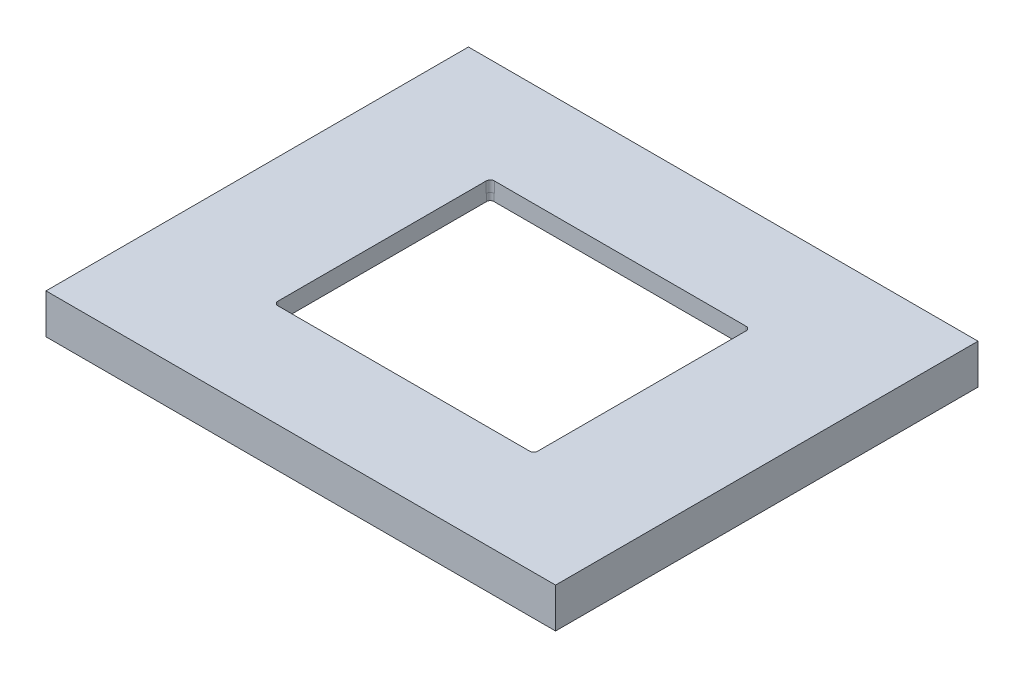
ISO-10303-21;
HEADER;
FILE_DESCRIPTION(('STEP AP214'),'2;1');
FILE_NAME('part.step','',(''),(''),'','','');
FILE_SCHEMA(('AUTOMOTIVE_DESIGN { 1 0 10303 214 1 1 1 1 }'));
ENDSEC;
DATA;
#1=APPLICATION_CONTEXT('core data for automotive mechanical design processes');
#2=APPLICATION_PROTOCOL_DEFINITION('international standard','automotive_design',2000,#1);
#3=PRODUCT_CONTEXT('',#1,'mechanical');
#4=PRODUCT('Part','Part','',(#3));
#5=PRODUCT_RELATED_PRODUCT_CATEGORY('part','',(#4));
#6=PRODUCT_DEFINITION_FORMATION('','',#4);
#7=PRODUCT_DEFINITION_CONTEXT('part definition',#1,'design');
#8=PRODUCT_DEFINITION('design','',#6,#7);
#9=PRODUCT_DEFINITION_SHAPE('','',#8);
#10=(LENGTH_UNIT() NAMED_UNIT(*) SI_UNIT(.MILLI.,.METRE.));
#11=(NAMED_UNIT(*) PLANE_ANGLE_UNIT() SI_UNIT($,.RADIAN.));
#12=(NAMED_UNIT(*) SI_UNIT($,.STERADIAN.) SOLID_ANGLE_UNIT());
#13=UNCERTAINTY_MEASURE_WITH_UNIT(LENGTH_MEASURE(1.E-05),#10,'distance_accuracy_value','');
#14=(GEOMETRIC_REPRESENTATION_CONTEXT(3) GLOBAL_UNCERTAINTY_ASSIGNED_CONTEXT((#13)) GLOBAL_UNIT_ASSIGNED_CONTEXT((#10,
#11,#12)) REPRESENTATION_CONTEXT('',''));
#15=CARTESIAN_POINT('',(0.,0.,0.));
#16=DIRECTION('',(0.,0.,1.));
#17=DIRECTION('',(1.,0.,0.));
#18=AXIS2_PLACEMENT_3D('',#15,#16,#17);
#19=CARTESIAN_POINT('',(0.,4.,0.));
#20=DIRECTION('',(0.,1.,0.));
#21=DIRECTION('',(0.,0.,1.));
#22=AXIS2_PLACEMENT_3D('',#19,#20,#21);
#23=PLANE('',#22);
#24=DIRECTION('',(0.,0.,1.));
#25=VECTOR('',#24,1.);
#26=CARTESIAN_POINT('',(-33.205,4.,27.185));
#27=LINE('',#26,#25);
#28=CARTESIAN_POINT('',(-33.205,4.,-27.185));
#29=VERTEX_POINT('',#28);
#30=CARTESIAN_POINT('',(-33.205,4.,27.185));
#31=VERTEX_POINT('',#30);
#32=EDGE_CURVE('E470',#29,#31,#27,.T.);
#33=ORIENTED_EDGE('',*,*,#32,.F.);
#34=DIRECTION('',(-1.,0.,0.));
#35=VECTOR('',#34,1.);
#36=CARTESIAN_POINT('',(33.205,4.,-27.185));
#37=LINE('',#36,#35);
#38=CARTESIAN_POINT('',(33.205,4.,-27.185));
#39=VERTEX_POINT('',#38);
#40=EDGE_CURVE('E483',#39,#29,#37,.T.);
#41=ORIENTED_EDGE('',*,*,#40,.F.);
#42=DIRECTION('',(0.,0.,-1.));
#43=VECTOR('',#42,1.);
#44=CARTESIAN_POINT('',(33.205,4.,27.185));
#45=LINE('',#44,#43);
#46=CARTESIAN_POINT('',(33.205,4.,27.185));
#47=VERTEX_POINT('',#46);
#48=EDGE_CURVE('E479',#47,#39,#45,.T.);
#49=ORIENTED_EDGE('',*,*,#48,.F.);
#50=DIRECTION('',(1.,0.,0.));
#51=VECTOR('',#50,1.);
#52=CARTESIAN_POINT('',(33.205,4.,27.185));
#53=LINE('',#52,#51);
#54=EDGE_CURVE('E474',#31,#47,#53,.T.);
#55=ORIENTED_EDGE('',*,*,#54,.F.);
#56=EDGE_LOOP('',(#33,#41,#49,#55));
#57=FACE_BOUND('',#56,.T.);
#58=CARTESIAN_POINT('',(17.45,4.,-14.45));
#59=DIRECTION('',(0.,-1.,0.));
#60=DIRECTION('',(0.,0.,-1.));
#61=AXIS2_PLACEMENT_3D('',#58,#59,#60);
#62=CIRCLE('',#61,1.5);
#63=CARTESIAN_POINT('',(17.45,4.,-15.95));
#64=VERTEX_POINT('',#63);
#65=CARTESIAN_POINT('',(18.95,4.,-14.45));
#66=VERTEX_POINT('',#65);
#67=EDGE_CURVE('E276',#64,#66,#62,.T.);
#68=ORIENTED_EDGE('',*,*,#67,.F.);
#69=DIRECTION('',(1.,0.,0.));
#70=VECTOR('',#69,1.);
#71=CARTESIAN_POINT('',(17.45,4.,-15.95));
#72=LINE('',#71,#70);
#73=CARTESIAN_POINT('',(-17.45,4.,-15.95));
#74=VERTEX_POINT('',#73);
#75=EDGE_CURVE('E360',#74,#64,#72,.T.);
#76=ORIENTED_EDGE('',*,*,#75,.F.);
#77=CARTESIAN_POINT('',(-17.45,4.,-14.45));
#78=DIRECTION('',(0.,-1.,0.));
#79=DIRECTION('',(0.,0.,1.));
#80=AXIS2_PLACEMENT_3D('',#77,#78,#79);
#81=CIRCLE('',#80,1.5);
#82=CARTESIAN_POINT('',(-18.95,4.,-14.45));
#83=VERTEX_POINT('',#82);
#84=EDGE_CURVE('E401',#83,#74,#81,.T.);
#85=ORIENTED_EDGE('',*,*,#84,.F.);
#86=DIRECTION('',(0.,0.,-1.));
#87=VECTOR('',#86,1.);
#88=CARTESIAN_POINT('',(-18.95,4.,-14.45));
#89=LINE('',#88,#87);
#90=CARTESIAN_POINT('',(-18.95,4.,14.45));
#91=VERTEX_POINT('',#90);
#92=EDGE_CURVE('E397',#91,#83,#89,.T.);
#93=ORIENTED_EDGE('',*,*,#92,.F.);
#94=CARTESIAN_POINT('',(-17.45,4.,14.45));
#95=DIRECTION('',(0.,-1.,0.));
#96=DIRECTION('',(0.,0.,1.));
#97=AXIS2_PLACEMENT_3D('',#94,#95,#96);
#98=CIRCLE('',#97,1.5);
#99=CARTESIAN_POINT('',(-17.45,4.,15.95));
#100=VERTEX_POINT('',#99);
#101=EDGE_CURVE('E393',#100,#91,#98,.T.);
#102=ORIENTED_EDGE('',*,*,#101,.F.);
#103=DIRECTION('',(-1.,0.,0.));
#104=VECTOR('',#103,1.);
#105=CARTESIAN_POINT('',(17.45,4.,15.95));
#106=LINE('',#105,#104);
#107=CARTESIAN_POINT('',(17.45,4.,15.95));
#108=VERTEX_POINT('',#107);
#109=EDGE_CURVE('E389',#108,#100,#106,.T.);
#110=ORIENTED_EDGE('',*,*,#109,.F.);
#111=CARTESIAN_POINT('',(17.45,4.,14.45));
#112=DIRECTION('',(0.,-1.,0.));
#113=DIRECTION('',(0.,0.,1.));
#114=AXIS2_PLACEMENT_3D('',#111,#112,#113);
#115=CIRCLE('',#114,1.5);
#116=CARTESIAN_POINT('',(18.95,4.,14.45));
#117=VERTEX_POINT('',#116);
#118=EDGE_CURVE('E66',#117,#108,#115,.T.);
#119=ORIENTED_EDGE('',*,*,#118,.F.);
#120=DIRECTION('',(0.,0.,1.));
#121=VECTOR('',#120,1.);
#122=CARTESIAN_POINT('',(18.95,4.,-14.45));
#123=LINE('',#122,#121);
#124=EDGE_CURVE('E61',#66,#117,#123,.T.);
#125=ORIENTED_EDGE('',*,*,#124,.F.);
#126=EDGE_LOOP('',(#68,#76,#85,#93,#102,#110,#119,#125));
#127=FACE_BOUND('',#126,.T.);
#128=ADVANCED_FACE('F45',(#57,#127),#23,.F.);
#129=CARTESIAN_POINT('',(-17.39,4.,-14.39));
#130=DIRECTION('',(0.,1.,0.));
#131=DIRECTION('',(0.,0.,1.));
#132=AXIS2_PLACEMENT_3D('',#129,#130,#131);
#133=CIRCLE('',#132,0.56);
#134=CARTESIAN_POINT('',(-17.39,4.,-14.95));
#135=VERTEX_POINT('',#134);
#136=CARTESIAN_POINT('',(-17.95,4.,-14.39));
#137=VERTEX_POINT('',#136);
#138=EDGE_CURVE('E54',#135,#137,#133,.T.);
#139=ORIENTED_EDGE('',*,*,#138,.T.);
#140=DIRECTION('',(0.,0.,-1.));
#141=VECTOR('',#140,1.);
#142=CARTESIAN_POINT('',(-17.95,4.,-14.45));
#143=LINE('',#142,#141);
#144=CARTESIAN_POINT('',(-17.95,4.,-14.45));
#145=VERTEX_POINT('',#144);
#146=EDGE_CURVE('E307',#137,#145,#143,.T.);
#147=ORIENTED_EDGE('',*,*,#146,.T.);
#148=CARTESIAN_POINT('',(-17.45,4.,-14.45));
#149=DIRECTION('',(0.,-1.,0.));
#150=DIRECTION('',(0.,0.,1.));
#151=AXIS2_PLACEMENT_3D('',#148,#149,#150);
#152=CIRCLE('',#151,0.5);
#153=CARTESIAN_POINT('',(-17.45,4.,-14.95));
#154=VERTEX_POINT('',#153);
#155=EDGE_CURVE('E310',#145,#154,#152,.T.);
#156=ORIENTED_EDGE('',*,*,#155,.T.);
#157=DIRECTION('',(1.,0.,0.));
#158=VECTOR('',#157,1.);
#159=CARTESIAN_POINT('',(17.45,4.,-14.95));
#160=LINE('',#159,#158);
#161=EDGE_CURVE('E314',#154,#135,#160,.T.);
#162=ORIENTED_EDGE('',*,*,#161,.T.);
#163=EDGE_LOOP('',(#139,#147,#156,#162));
#164=FACE_BOUND('',#163,.T.);
#165=ADVANCED_FACE('F591',(#164),#23,.F.);
#166=CARTESIAN_POINT('',(17.39,4.,-14.39));
#167=DIRECTION('',(0.,1.,0.));
#168=DIRECTION('',(0.,0.,1.));
#169=AXIS2_PLACEMENT_3D('',#166,#167,#168);
#170=CIRCLE('',#169,0.56);
#171=CARTESIAN_POINT('',(17.95,4.,-14.39));
#172=VERTEX_POINT('',#171);
#173=CARTESIAN_POINT('',(17.39,4.,-14.95));
#174=VERTEX_POINT('',#173);
#175=EDGE_CURVE('E582',#172,#174,#170,.T.);
#176=ORIENTED_EDGE('',*,*,#175,.T.);
#177=CARTESIAN_POINT('',(17.45,4.,-14.95));
#178=VERTEX_POINT('',#177);
#179=EDGE_CURVE('E313',#174,#178,#160,.T.);
#180=ORIENTED_EDGE('',*,*,#179,.T.);
#181=CARTESIAN_POINT('',(17.45,4.,-14.45));
#182=DIRECTION('',(0.,-1.,0.));
#183=DIRECTION('',(0.,0.,-1.));
#184=AXIS2_PLACEMENT_3D('',#181,#182,#183);
#185=CIRCLE('',#184,0.5);
#186=CARTESIAN_POINT('',(17.95,4.,-14.45));
#187=VERTEX_POINT('',#186);
#188=EDGE_CURVE('E317',#178,#187,#185,.T.);
#189=ORIENTED_EDGE('',*,*,#188,.T.);
#190=DIRECTION('',(0.,0.,1.));
#191=VECTOR('',#190,1.);
#192=CARTESIAN_POINT('',(17.95,4.,-14.45));
#193=LINE('',#192,#191);
#194=EDGE_CURVE('E321',#187,#172,#193,.T.);
#195=ORIENTED_EDGE('',*,*,#194,.T.);
#196=EDGE_LOOP('',(#176,#180,#189,#195));
#197=FACE_BOUND('',#196,.T.);
#198=ADVANCED_FACE('F649',(#197),#23,.F.);
#199=CARTESIAN_POINT('',(17.39,4.,14.39));
#200=DIRECTION('',(0.,1.,0.));
#201=DIRECTION('',(0.,0.,1.));
#202=AXIS2_PLACEMENT_3D('',#199,#200,#201);
#203=CIRCLE('',#202,0.56);
#204=CARTESIAN_POINT('',(17.39,4.,14.95));
#205=VERTEX_POINT('',#204);
#206=CARTESIAN_POINT('',(17.95,4.,14.39));
#207=VERTEX_POINT('',#206);
#208=EDGE_CURVE('E570',#205,#207,#203,.T.);
#209=ORIENTED_EDGE('',*,*,#208,.T.);
#210=CARTESIAN_POINT('',(17.95,4.,14.45));
#211=VERTEX_POINT('',#210);
#212=EDGE_CURVE('E320',#207,#211,#193,.T.);
#213=ORIENTED_EDGE('',*,*,#212,.T.);
#214=CARTESIAN_POINT('',(17.45,4.,14.45));
#215=DIRECTION('',(0.,-1.,0.));
#216=DIRECTION('',(0.,0.,1.));
#217=AXIS2_PLACEMENT_3D('',#214,#215,#216);
#218=CIRCLE('',#217,0.5);
#219=CARTESIAN_POINT('',(17.45,4.,14.95));
#220=VERTEX_POINT('',#219);
#221=EDGE_CURVE('E324',#211,#220,#218,.T.);
#222=ORIENTED_EDGE('',*,*,#221,.T.);
#223=DIRECTION('',(-1.,0.,0.));
#224=VECTOR('',#223,1.);
#225=CARTESIAN_POINT('',(17.45,4.,14.95));
#226=LINE('',#225,#224);
#227=EDGE_CURVE('E265',#220,#205,#226,.T.);
#228=ORIENTED_EDGE('',*,*,#227,.T.);
#229=EDGE_LOOP('',(#209,#213,#222,#228));
#230=FACE_BOUND('',#229,.T.);
#231=ADVANCED_FACE('F654',(#230),#23,.F.);
#232=CARTESIAN_POINT('',(0.,0.,0.));
#233=DIRECTION('',(0.,-1.,0.));
#234=DIRECTION('',(0.,0.,-1.));
#235=AXIS2_PLACEMENT_3D('',#232,#233,#234);
#236=PLANE('',#235);
#237=DIRECTION('',(1.,0.,0.));
#238=VECTOR('',#237,1.);
#239=CARTESIAN_POINT('',(35.205,0.,29.185));
#240=LINE('',#239,#238);
#241=CARTESIAN_POINT('',(-35.205,0.,29.185));
#242=VERTEX_POINT('',#241);
#243=CARTESIAN_POINT('',(35.205,0.,29.185));
#244=VERTEX_POINT('',#243);
#245=EDGE_CURVE('E515',#242,#244,#240,.T.);
#246=ORIENTED_EDGE('',*,*,#245,.F.);
#247=DIRECTION('',(0.,0.,1.));
#248=VECTOR('',#247,1.);
#249=CARTESIAN_POINT('',(-35.205,0.,29.185));
#250=LINE('',#249,#248);
#251=CARTESIAN_POINT('',(-35.205,0.,-29.185));
#252=VERTEX_POINT('',#251);
#253=EDGE_CURVE('E525',#252,#242,#250,.T.);
#254=ORIENTED_EDGE('',*,*,#253,.F.);
#255=DIRECTION('',(-1.,0.,0.));
#256=VECTOR('',#255,1.);
#257=CARTESIAN_POINT('',(35.205,0.,-29.185));
#258=LINE('',#257,#256);
#259=CARTESIAN_POINT('',(35.205,0.,-29.185));
#260=VERTEX_POINT('',#259);
#261=EDGE_CURVE('E522',#260,#252,#258,.T.);
#262=ORIENTED_EDGE('',*,*,#261,.F.);
#263=DIRECTION('',(0.,0.,-1.));
#264=VECTOR('',#263,1.);
#265=CARTESIAN_POINT('',(35.205,0.,29.185));
#266=LINE('',#265,#264);
#267=EDGE_CURVE('E519',#244,#260,#266,.T.);
#268=ORIENTED_EDGE('',*,*,#267,.F.);
#269=EDGE_LOOP('',(#246,#254,#262,#268));
#270=FACE_BOUND('',#269,.T.);
#271=DIRECTION('',(-1.,0.,0.));
#272=VECTOR('',#271,1.);
#273=CARTESIAN_POINT('',(33.205,0.,-27.185));
#274=LINE('',#273,#272);
#275=CARTESIAN_POINT('',(33.205,0.,-27.185));
#276=VERTEX_POINT('',#275);
#277=CARTESIAN_POINT('',(-33.205,0.,-27.185));
#278=VERTEX_POINT('',#277);
#279=EDGE_CURVE('E475',#276,#278,#274,.T.);
#280=ORIENTED_EDGE('',*,*,#279,.T.);
#281=DIRECTION('',(0.,0.,1.));
#282=VECTOR('',#281,1.);
#283=CARTESIAN_POINT('',(-33.205,0.,27.185));
#284=LINE('',#283,#282);
#285=CARTESIAN_POINT('',(-33.205,0.,27.185));
#286=VERTEX_POINT('',#285);
#287=EDGE_CURVE('E469',#278,#286,#284,.T.);
#288=ORIENTED_EDGE('',*,*,#287,.T.);
#289=DIRECTION('',(1.,0.,0.));
#290=VECTOR('',#289,1.);
#291=CARTESIAN_POINT('',(33.205,0.,27.185));
#292=LINE('',#291,#290);
#293=CARTESIAN_POINT('',(33.205,0.,27.185));
#294=VERTEX_POINT('',#293);
#295=EDGE_CURVE('E491',#286,#294,#292,.T.);
#296=ORIENTED_EDGE('',*,*,#295,.T.);
#297=DIRECTION('',(0.,0.,-1.));
#298=VECTOR('',#297,1.);
#299=CARTESIAN_POINT('',(33.205,0.,27.185));
#300=LINE('',#299,#298);
#301=EDGE_CURVE('E495',#294,#276,#300,.T.);
#302=ORIENTED_EDGE('',*,*,#301,.T.);
#303=EDGE_LOOP('',(#280,#288,#296,#302));
#304=FACE_BOUND('',#303,.T.);
#305=ADVANCED_FACE('F662',(#270,#304),#236,.T.);
#306=CARTESIAN_POINT('',(35.205,4.,29.185));
#307=DIRECTION('',(0.,0.,-1.));
#308=DIRECTION('',(-1.,0.,0.));
#309=AXIS2_PLACEMENT_3D('',#306,#307,#308);
#310=PLANE('',#309);
#311=ORIENTED_EDGE('',*,*,#245,.T.);
#312=DIRECTION('',(0.,-1.,0.));
#313=VECTOR('',#312,1.);
#314=CARTESIAN_POINT('',(35.205,4.,29.185));
#315=LINE('',#314,#313);
#316=CARTESIAN_POINT('',(35.205,5.5,29.185));
#317=VERTEX_POINT('',#316);
#318=EDGE_CURVE('E540',#317,#244,#315,.T.);
#319=ORIENTED_EDGE('',*,*,#318,.F.);
#320=DIRECTION('',(1.,0.,0.));
#321=VECTOR('',#320,1.);
#322=CARTESIAN_POINT('',(35.205,5.5,29.185));
#323=LINE('',#322,#321);
#324=CARTESIAN_POINT('',(-35.205,5.5,29.185));
#325=VERTEX_POINT('',#324);
#326=EDGE_CURVE('E457',#325,#317,#323,.T.);
#327=ORIENTED_EDGE('',*,*,#326,.F.);
#328=DIRECTION('',(0.,-1.,0.));
#329=VECTOR('',#328,1.);
#330=CARTESIAN_POINT('',(-35.205,4.,29.185));
#331=LINE('',#330,#329);
#332=EDGE_CURVE('E528',#325,#242,#331,.T.);
#333=ORIENTED_EDGE('',*,*,#332,.T.);
#334=EDGE_LOOP('',(#311,#319,#327,#333));
#335=FACE_BOUND('',#334,.T.);
#336=ADVANCED_FACE('F668',(#335),#310,.F.);
#337=CARTESIAN_POINT('',(35.205,4.,29.185));
#338=DIRECTION('',(-1.,0.,0.));
#339=DIRECTION('',(0.,0.,1.));
#340=AXIS2_PLACEMENT_3D('',#337,#338,#339);
#341=PLANE('',#340);
#342=ORIENTED_EDGE('',*,*,#267,.T.);
#343=DIRECTION('',(0.,-1.,0.));
#344=VECTOR('',#343,1.);
#345=CARTESIAN_POINT('',(35.205,4.,-29.185));
#346=LINE('',#345,#344);
#347=CARTESIAN_POINT('',(35.205,5.5,-29.185));
#348=VERTEX_POINT('',#347);
#349=EDGE_CURVE('E536',#348,#260,#346,.T.);
#350=ORIENTED_EDGE('',*,*,#349,.F.);
#351=DIRECTION('',(0.,0.,-1.));
#352=VECTOR('',#351,1.);
#353=CARTESIAN_POINT('',(35.205,5.5,29.185));
#354=LINE('',#353,#352);
#355=EDGE_CURVE('E461',#317,#348,#354,.T.);
#356=ORIENTED_EDGE('',*,*,#355,.F.);
#357=ORIENTED_EDGE('',*,*,#318,.T.);
#358=EDGE_LOOP('',(#342,#350,#356,#357));
#359=FACE_BOUND('',#358,.T.);
#360=ADVANCED_FACE('F701',(#359),#341,.F.);
#361=CARTESIAN_POINT('',(35.205,4.,-29.185));
#362=DIRECTION('',(0.,0.,1.));
#363=DIRECTION('',(1.,0.,0.));
#364=AXIS2_PLACEMENT_3D('',#361,#362,#363);
#365=PLANE('',#364);
#366=ORIENTED_EDGE('',*,*,#261,.T.);
#367=DIRECTION('',(0.,-1.,0.));
#368=VECTOR('',#367,1.);
#369=CARTESIAN_POINT('',(-35.205,4.,-29.185));
#370=LINE('',#369,#368);
#371=CARTESIAN_POINT('',(-35.205,5.5,-29.185));
#372=VERTEX_POINT('',#371);
#373=EDGE_CURVE('E532',#372,#252,#370,.T.);
#374=ORIENTED_EDGE('',*,*,#373,.F.);
#375=DIRECTION('',(-1.,0.,0.));
#376=VECTOR('',#375,1.);
#377=CARTESIAN_POINT('',(35.205,5.5,-29.185));
#378=LINE('',#377,#376);
#379=EDGE_CURVE('E465',#348,#372,#378,.T.);
#380=ORIENTED_EDGE('',*,*,#379,.F.);
#381=ORIENTED_EDGE('',*,*,#349,.T.);
#382=EDGE_LOOP('',(#366,#374,#380,#381));
#383=FACE_BOUND('',#382,.T.);
#384=ADVANCED_FACE('F705',(#383),#365,.F.);
#385=CARTESIAN_POINT('',(-35.205,4.,29.185));
#386=DIRECTION('',(1.,0.,0.));
#387=DIRECTION('',(0.,0.,-1.));
#388=AXIS2_PLACEMENT_3D('',#385,#386,#387);
#389=PLANE('',#388);
#390=ORIENTED_EDGE('',*,*,#253,.T.);
#391=ORIENTED_EDGE('',*,*,#332,.F.);
#392=DIRECTION('',(0.,0.,1.));
#393=VECTOR('',#392,1.);
#394=CARTESIAN_POINT('',(-35.205,5.5,29.185));
#395=LINE('',#394,#393);
#396=EDGE_CURVE('E453',#372,#325,#395,.T.);
#397=ORIENTED_EDGE('',*,*,#396,.F.);
#398=ORIENTED_EDGE('',*,*,#373,.T.);
#399=EDGE_LOOP('',(#390,#391,#397,#398));
#400=FACE_BOUND('',#399,.T.);
#401=ADVANCED_FACE('F709',(#400),#389,.F.);
#402=CARTESIAN_POINT('',(-33.205,4.,27.185));
#403=DIRECTION('',(1.,0.,0.));
#404=DIRECTION('',(0.,0.,-1.));
#405=AXIS2_PLACEMENT_3D('',#402,#403,#404);
#406=PLANE('',#405);
#407=ORIENTED_EDGE('',*,*,#287,.F.);
#408=DIRECTION('',(0.,-1.,0.));
#409=VECTOR('',#408,1.);
#410=CARTESIAN_POINT('',(-33.205,4.,-27.185));
#411=LINE('',#410,#409);
#412=EDGE_CURVE('E487',#29,#278,#411,.T.);
#413=ORIENTED_EDGE('',*,*,#412,.F.);
#414=ORIENTED_EDGE('',*,*,#32,.T.);
#415=DIRECTION('',(0.,-1.,0.));
#416=VECTOR('',#415,1.);
#417=CARTESIAN_POINT('',(-33.205,4.,27.185));
#418=LINE('',#417,#416);
#419=EDGE_CURVE('E511',#31,#286,#418,.T.);
#420=ORIENTED_EDGE('',*,*,#419,.T.);
#421=EDGE_LOOP('',(#407,#413,#414,#420));
#422=FACE_BOUND('',#421,.T.);
#423=ADVANCED_FACE('F712',(#422),#406,.T.);
#424=CARTESIAN_POINT('',(33.205,4.,27.185));
#425=DIRECTION('',(0.,0.,-1.));
#426=DIRECTION('',(-1.,0.,0.));
#427=AXIS2_PLACEMENT_3D('',#424,#425,#426);
#428=PLANE('',#427);
#429=ORIENTED_EDGE('',*,*,#295,.F.);
#430=ORIENTED_EDGE('',*,*,#419,.F.);
#431=ORIENTED_EDGE('',*,*,#54,.T.);
#432=DIRECTION('',(0.,-1.,0.));
#433=VECTOR('',#432,1.);
#434=CARTESIAN_POINT('',(33.205,4.,27.185));
#435=LINE('',#434,#433);
#436=EDGE_CURVE('E508',#47,#294,#435,.T.);
#437=ORIENTED_EDGE('',*,*,#436,.T.);
#438=EDGE_LOOP('',(#429,#430,#431,#437));
#439=FACE_BOUND('',#438,.T.);
#440=ADVANCED_FACE('F717',(#439),#428,.T.);
#441=CARTESIAN_POINT('',(33.205,4.,27.185));
#442=DIRECTION('',(-1.,0.,0.));
#443=DIRECTION('',(0.,0.,1.));
#444=AXIS2_PLACEMENT_3D('',#441,#442,#443);
#445=PLANE('',#444);
#446=ORIENTED_EDGE('',*,*,#301,.F.);
#447=ORIENTED_EDGE('',*,*,#436,.F.);
#448=ORIENTED_EDGE('',*,*,#48,.T.);
#449=DIRECTION('',(0.,-1.,0.));
#450=VECTOR('',#449,1.);
#451=CARTESIAN_POINT('',(33.205,4.,-27.185));
#452=LINE('',#451,#450);
#453=EDGE_CURVE('E505',#39,#276,#452,.T.);
#454=ORIENTED_EDGE('',*,*,#453,.T.);
#455=EDGE_LOOP('',(#446,#447,#448,#454));
#456=FACE_BOUND('',#455,.T.);
#457=ADVANCED_FACE('F721',(#456),#445,.T.);
#458=CARTESIAN_POINT('',(33.205,4.,-27.185));
#459=DIRECTION('',(0.,0.,1.));
#460=DIRECTION('',(1.,0.,0.));
#461=AXIS2_PLACEMENT_3D('',#458,#459,#460);
#462=PLANE('',#461);
#463=ORIENTED_EDGE('',*,*,#279,.F.);
#464=ORIENTED_EDGE('',*,*,#453,.F.);
#465=ORIENTED_EDGE('',*,*,#40,.T.);
#466=ORIENTED_EDGE('',*,*,#412,.T.);
#467=EDGE_LOOP('',(#463,#464,#465,#466));
#468=FACE_BOUND('',#467,.T.);
#469=ADVANCED_FACE('F660',(#468),#462,.T.);
#470=CARTESIAN_POINT('',(0.,5.5,0.));
#471=DIRECTION('',(0.,1.,0.));
#472=DIRECTION('',(0.,0.,1.));
#473=AXIS2_PLACEMENT_3D('',#470,#471,#472);
#474=PLANE('',#473);
#475=ORIENTED_EDGE('',*,*,#396,.T.);
#476=ORIENTED_EDGE('',*,*,#326,.T.);
#477=ORIENTED_EDGE('',*,*,#355,.T.);
#478=ORIENTED_EDGE('',*,*,#379,.T.);
#479=EDGE_LOOP('',(#475,#476,#477,#478));
#480=FACE_BOUND('',#479,.T.);
#481=DIRECTION('',(-1.,0.,0.));
#482=VECTOR('',#481,1.);
#483=CARTESIAN_POINT('',(-17.95,5.5,-14.95));
#484=LINE('',#483,#482);
#485=CARTESIAN_POINT('',(17.39,5.5,-14.95));
#486=VERTEX_POINT('',#485);
#487=CARTESIAN_POINT('',(-17.39,5.5,-14.95));
#488=VERTEX_POINT('',#487);
#489=EDGE_CURVE('E442',#486,#488,#484,.T.);
#490=ORIENTED_EDGE('',*,*,#489,.F.);
#491=CARTESIAN_POINT('',(17.39,5.5,-14.39));
#492=DIRECTION('',(0.,1.,0.));
#493=DIRECTION('',(0.,0.,1.));
#494=AXIS2_PLACEMENT_3D('',#491,#492,#493);
#495=CIRCLE('',#494,0.56);
#496=CARTESIAN_POINT('',(17.95,5.5,-14.39));
#497=VERTEX_POINT('',#496);
#498=EDGE_CURVE('E585',#486,#497,#495,.F.);
#499=ORIENTED_EDGE('',*,*,#498,.T.);
#500=DIRECTION('',(0.,0.,-1.));
#501=VECTOR('',#500,1.);
#502=CARTESIAN_POINT('',(17.95,5.5,14.95));
#503=LINE('',#502,#501);
#504=CARTESIAN_POINT('',(17.95,5.5,14.39));
#505=VERTEX_POINT('',#504);
#506=EDGE_CURVE('E438',#505,#497,#503,.T.);
#507=ORIENTED_EDGE('',*,*,#506,.F.);
#508=CARTESIAN_POINT('',(17.39,5.5,14.39));
#509=DIRECTION('',(0.,1.,0.));
#510=DIRECTION('',(0.,0.,1.));
#511=AXIS2_PLACEMENT_3D('',#508,#509,#510);
#512=CIRCLE('',#511,0.56);
#513=CARTESIAN_POINT('',(17.39,5.5,14.95));
#514=VERTEX_POINT('',#513);
#515=EDGE_CURVE('E573',#505,#514,#512,.F.);
#516=ORIENTED_EDGE('',*,*,#515,.T.);
#517=DIRECTION('',(1.,0.,0.));
#518=VECTOR('',#517,1.);
#519=CARTESIAN_POINT('',(-17.95,5.5,14.95));
#520=LINE('',#519,#518);
#521=CARTESIAN_POINT('',(-17.39,5.5,14.95));
#522=VERTEX_POINT('',#521);
#523=EDGE_CURVE('E449',#522,#514,#520,.T.);
#524=ORIENTED_EDGE('',*,*,#523,.F.);
#525=CARTESIAN_POINT('',(-17.39,5.5,14.39));
#526=DIRECTION('',(0.,1.,0.));
#527=DIRECTION('',(0.,0.,1.));
#528=AXIS2_PLACEMENT_3D('',#525,#526,#527);
#529=CIRCLE('',#528,0.56);
#530=CARTESIAN_POINT('',(-17.95,5.5,14.39));
#531=VERTEX_POINT('',#530);
#532=EDGE_CURVE('E579',#522,#531,#529,.F.);
#533=ORIENTED_EDGE('',*,*,#532,.T.);
#534=DIRECTION('',(0.,0.,1.));
#535=VECTOR('',#534,1.);
#536=CARTESIAN_POINT('',(-17.95,5.5,14.95));
#537=LINE('',#536,#535);
#538=CARTESIAN_POINT('',(-17.95,5.5,-14.39));
#539=VERTEX_POINT('',#538);
#540=EDGE_CURVE('E446',#539,#531,#537,.T.);
#541=ORIENTED_EDGE('',*,*,#540,.F.);
#542=CARTESIAN_POINT('',(-17.39,5.5,-14.39));
#543=DIRECTION('',(0.,1.,0.));
#544=DIRECTION('',(0.,0.,1.));
#545=AXIS2_PLACEMENT_3D('',#542,#543,#544);
#546=CIRCLE('',#545,0.56);
#547=EDGE_CURVE('E11',#539,#488,#546,.F.);
#548=ORIENTED_EDGE('',*,*,#547,.T.);
#549=EDGE_LOOP('',(#490,#499,#507,#516,#524,#533,#541,#548));
#550=FACE_BOUND('',#549,.T.);
#551=ADVANCED_FACE('F653',(#480,#550),#474,.T.);
#552=CARTESIAN_POINT('',(-17.45,4.,14.45));
#553=DIRECTION('',(0.,-1.,0.));
#554=DIRECTION('',(0.,0.,1.));
#555=AXIS2_PLACEMENT_3D('',#552,#553,#554);
#556=CIRCLE('',#555,0.5);
#557=CARTESIAN_POINT('',(-17.45,4.,14.95));
#558=VERTEX_POINT('',#557);
#559=CARTESIAN_POINT('',(-17.95,4.,14.45));
#560=VERTEX_POINT('',#559);
#561=EDGE_CURVE('E304',#558,#560,#556,.T.);
#562=ORIENTED_EDGE('',*,*,#561,.T.);
#563=CARTESIAN_POINT('',(-17.95,4.,14.39));
#564=VERTEX_POINT('',#563);
#565=EDGE_CURVE('E274',#560,#564,#143,.T.);
#566=ORIENTED_EDGE('',*,*,#565,.T.);
#567=CARTESIAN_POINT('',(-17.39,4.,14.39));
#568=DIRECTION('',(0.,1.,0.));
#569=DIRECTION('',(0.,0.,1.));
#570=AXIS2_PLACEMENT_3D('',#567,#568,#569);
#571=CIRCLE('',#570,0.56);
#572=CARTESIAN_POINT('',(-17.39,4.,14.95));
#573=VERTEX_POINT('',#572);
#574=EDGE_CURVE('E576',#564,#573,#571,.T.);
#575=ORIENTED_EDGE('',*,*,#574,.T.);
#576=EDGE_CURVE('E327',#573,#558,#226,.T.);
#577=ORIENTED_EDGE('',*,*,#576,.T.);
#578=EDGE_LOOP('',(#562,#566,#575,#577));
#579=FACE_BOUND('',#578,.T.);
#580=ADVANCED_FACE('F605',(#579),#23,.F.);
#581=CARTESIAN_POINT('',(17.95,5.5,14.95));
#582=DIRECTION('',(-1.,0.,0.));
#583=DIRECTION('',(0.,0.,1.));
#584=AXIS2_PLACEMENT_3D('',#581,#582,#583);
#585=PLANE('',#584);
#586=DIRECTION('',(0.,-1.,0.));
#587=VECTOR('',#586,1.);
#588=CARTESIAN_POINT('',(17.95,4.,-14.39));
#589=LINE('',#588,#587);
#590=EDGE_CURVE('E550',#497,#172,#589,.T.);
#591=ORIENTED_EDGE('',*,*,#590,.T.);
#592=ORIENTED_EDGE('',*,*,#194,.F.);
#593=DIRECTION('',(0.,1.,0.));
#594=VECTOR('',#593,1.);
#595=CARTESIAN_POINT('',(17.95,3.,-14.45));
#596=LINE('',#595,#594);
#597=CARTESIAN_POINT('',(17.95,3.,-14.45));
#598=VERTEX_POINT('',#597);
#599=EDGE_CURVE('E341',#598,#187,#596,.T.);
#600=ORIENTED_EDGE('',*,*,#599,.F.);
#601=DIRECTION('',(0.,0.,1.));
#602=VECTOR('',#601,1.);
#603=CARTESIAN_POINT('',(17.95,3.,-14.45));
#604=LINE('',#603,#602);
#605=CARTESIAN_POINT('',(17.95,3.,14.45));
#606=VERTEX_POINT('',#605);
#607=EDGE_CURVE('E294',#598,#606,#604,.T.);
#608=ORIENTED_EDGE('',*,*,#607,.T.);
#609=DIRECTION('',(0.,1.,0.));
#610=VECTOR('',#609,1.);
#611=CARTESIAN_POINT('',(17.95,3.,14.45));
#612=LINE('',#611,#610);
#613=EDGE_CURVE('E337',#606,#211,#612,.T.);
#614=ORIENTED_EDGE('',*,*,#613,.T.);
#615=ORIENTED_EDGE('',*,*,#212,.F.);
#616=DIRECTION('',(0.,-1.,0.));
#617=VECTOR('',#616,1.);
#618=CARTESIAN_POINT('',(17.95,5.5,14.39));
#619=LINE('',#618,#617);
#620=EDGE_CURVE('E554',#207,#505,#619,.F.);
#621=ORIENTED_EDGE('',*,*,#620,.T.);
#622=ORIENTED_EDGE('',*,*,#506,.T.);
#623=EDGE_LOOP('',(#591,#592,#600,#608,#614,#615,#621,#622));
#624=FACE_BOUND('',#623,.T.);
#625=ADVANCED_FACE('F620',(#624),#585,.T.);
#626=CARTESIAN_POINT('',(-17.95,5.5,-14.95));
#627=DIRECTION('',(0.,0.,1.));
#628=DIRECTION('',(1.,0.,0.));
#629=AXIS2_PLACEMENT_3D('',#626,#627,#628);
#630=PLANE('',#629);
#631=DIRECTION('',(0.,-1.,0.));
#632=VECTOR('',#631,1.);
#633=CARTESIAN_POINT('',(-17.39,4.,-14.95));
#634=LINE('',#633,#632);
#635=EDGE_CURVE('E563',#488,#135,#634,.T.);
#636=ORIENTED_EDGE('',*,*,#635,.T.);
#637=ORIENTED_EDGE('',*,*,#161,.F.);
#638=DIRECTION('',(0.,1.,0.));
#639=VECTOR('',#638,1.);
#640=CARTESIAN_POINT('',(-17.45,3.,-14.95));
#641=LINE('',#640,#639);
#642=CARTESIAN_POINT('',(-17.45,3.,-14.95));
#643=VERTEX_POINT('',#642);
#644=EDGE_CURVE('E349',#643,#154,#641,.T.);
#645=ORIENTED_EDGE('',*,*,#644,.F.);
#646=DIRECTION('',(1.,0.,0.));
#647=VECTOR('',#646,1.);
#648=CARTESIAN_POINT('',(17.45,3.,-14.95));
#649=LINE('',#648,#647);
#650=CARTESIAN_POINT('',(17.45,3.,-14.95));
#651=VERTEX_POINT('',#650);
#652=EDGE_CURVE('E286',#643,#651,#649,.T.);
#653=ORIENTED_EDGE('',*,*,#652,.T.);
#654=DIRECTION('',(0.,1.,0.));
#655=VECTOR('',#654,1.);
#656=CARTESIAN_POINT('',(17.45,3.,-14.95));
#657=LINE('',#656,#655);
#658=EDGE_CURVE('E345',#651,#178,#657,.T.);
#659=ORIENTED_EDGE('',*,*,#658,.T.);
#660=ORIENTED_EDGE('',*,*,#179,.F.);
#661=DIRECTION('',(0.,-1.,0.));
#662=VECTOR('',#661,1.);
#663=CARTESIAN_POINT('',(17.39,5.5,-14.95));
#664=LINE('',#663,#662);
#665=EDGE_CURVE('E567',#174,#486,#664,.F.);
#666=ORIENTED_EDGE('',*,*,#665,.T.);
#667=ORIENTED_EDGE('',*,*,#489,.T.);
#668=EDGE_LOOP('',(#636,#637,#645,#653,#659,#660,#666,#667));
#669=FACE_BOUND('',#668,.T.);
#670=ADVANCED_FACE('F629',(#669),#630,.T.);
#671=CARTESIAN_POINT('',(-17.95,5.5,14.95));
#672=DIRECTION('',(1.,0.,0.));
#673=DIRECTION('',(0.,0.,-1.));
#674=AXIS2_PLACEMENT_3D('',#671,#672,#673);
#675=PLANE('',#674);
#676=ORIENTED_EDGE('',*,*,#540,.T.);
#677=DIRECTION('',(0.,-1.,0.));
#678=VECTOR('',#677,1.);
#679=CARTESIAN_POINT('',(-17.95,4.,14.39));
#680=LINE('',#679,#678);
#681=EDGE_CURVE('E560',#531,#564,#680,.T.);
#682=ORIENTED_EDGE('',*,*,#681,.T.);
#683=ORIENTED_EDGE('',*,*,#565,.F.);
#684=DIRECTION('',(0.,1.,0.));
#685=VECTOR('',#684,1.);
#686=CARTESIAN_POINT('',(-17.95,3.,14.45));
#687=LINE('',#686,#685);
#688=CARTESIAN_POINT('',(-17.95,3.,14.45));
#689=VERTEX_POINT('',#688);
#690=EDGE_CURVE('E257',#689,#560,#687,.T.);
#691=ORIENTED_EDGE('',*,*,#690,.F.);
#692=DIRECTION('',(0.,0.,-1.));
#693=VECTOR('',#692,1.);
#694=CARTESIAN_POINT('',(-17.95,3.,-14.45));
#695=LINE('',#694,#693);
#696=CARTESIAN_POINT('',(-17.95,3.,-14.45));
#697=VERTEX_POINT('',#696);
#698=EDGE_CURVE('E264',#689,#697,#695,.T.);
#699=ORIENTED_EDGE('',*,*,#698,.T.);
#700=DIRECTION('',(0.,1.,0.));
#701=VECTOR('',#700,1.);
#702=CARTESIAN_POINT('',(-17.95,3.,-14.45));
#703=LINE('',#702,#701);
#704=EDGE_CURVE('E277',#697,#145,#703,.T.);
#705=ORIENTED_EDGE('',*,*,#704,.T.);
#706=ORIENTED_EDGE('',*,*,#146,.F.);
#707=DIRECTION('',(0.,-1.,0.));
#708=VECTOR('',#707,1.);
#709=CARTESIAN_POINT('',(-17.95,5.5,-14.39));
#710=LINE('',#709,#708);
#711=EDGE_CURVE('E557',#137,#539,#710,.F.);
#712=ORIENTED_EDGE('',*,*,#711,.T.);
#713=EDGE_LOOP('',(#676,#682,#683,#691,#699,#705,#706,#712));
#714=FACE_BOUND('',#713,.T.);
#715=ADVANCED_FACE('F270',(#714),#675,.T.);
#716=CARTESIAN_POINT('',(-17.95,5.5,14.95));
#717=DIRECTION('',(0.,0.,-1.));
#718=DIRECTION('',(-1.,0.,0.));
#719=AXIS2_PLACEMENT_3D('',#716,#717,#718);
#720=PLANE('',#719);
#721=ORIENTED_EDGE('',*,*,#523,.T.);
#722=DIRECTION('',(0.,-1.,0.));
#723=VECTOR('',#722,1.);
#724=CARTESIAN_POINT('',(17.39,4.,14.95));
#725=LINE('',#724,#723);
#726=EDGE_CURVE('E547',#514,#205,#725,.T.);
#727=ORIENTED_EDGE('',*,*,#726,.T.);
#728=ORIENTED_EDGE('',*,*,#227,.F.);
#729=DIRECTION('',(0.,1.,0.));
#730=VECTOR('',#729,1.);
#731=CARTESIAN_POINT('',(17.45,3.,14.95));
#732=LINE('',#731,#730);
#733=CARTESIAN_POINT('',(17.45,3.,14.95));
#734=VERTEX_POINT('',#733);
#735=EDGE_CURVE('E333',#734,#220,#732,.T.);
#736=ORIENTED_EDGE('',*,*,#735,.F.);
#737=DIRECTION('',(-1.,0.,0.));
#738=VECTOR('',#737,1.);
#739=CARTESIAN_POINT('',(17.45,3.,14.95));
#740=LINE('',#739,#738);
#741=CARTESIAN_POINT('',(-17.45,3.,14.95));
#742=VERTEX_POINT('',#741);
#743=EDGE_CURVE('E301',#734,#742,#740,.T.);
#744=ORIENTED_EDGE('',*,*,#743,.T.);
#745=DIRECTION('',(0.,1.,0.));
#746=VECTOR('',#745,1.);
#747=CARTESIAN_POINT('',(-17.45,3.,14.95));
#748=LINE('',#747,#746);
#749=EDGE_CURVE('E259',#742,#558,#748,.T.);
#750=ORIENTED_EDGE('',*,*,#749,.T.);
#751=ORIENTED_EDGE('',*,*,#576,.F.);
#752=DIRECTION('',(0.,-1.,0.));
#753=VECTOR('',#752,1.);
#754=CARTESIAN_POINT('',(-17.39,5.5,14.95));
#755=LINE('',#754,#753);
#756=EDGE_CURVE('E544',#573,#522,#755,.F.);
#757=ORIENTED_EDGE('',*,*,#756,.T.);
#758=EDGE_LOOP('',(#721,#727,#728,#736,#744,#750,#751,#757));
#759=FACE_BOUND('',#758,.T.);
#760=ADVANCED_FACE('F609',(#759),#720,.T.);
#761=CARTESIAN_POINT('',(17.39,5.5,14.39));
#762=DIRECTION('',(0.,1.,0.));
#763=DIRECTION('',(0.,0.,1.));
#764=AXIS2_PLACEMENT_3D('',#761,#762,#763);
#765=CYLINDRICAL_SURFACE('',#764,0.56);
#766=ORIENTED_EDGE('',*,*,#515,.F.);
#767=ORIENTED_EDGE('',*,*,#620,.F.);
#768=ORIENTED_EDGE('',*,*,#208,.F.);
#769=ORIENTED_EDGE('',*,*,#726,.F.);
#770=EDGE_LOOP('',(#766,#767,#768,#769));
#771=FACE_BOUND('',#770,.T.);
#772=ADVANCED_FACE('F677',(#771),#765,.F.);
#773=CARTESIAN_POINT('',(-17.39,5.5,14.39));
#774=DIRECTION('',(0.,1.,0.));
#775=DIRECTION('',(0.,0.,1.));
#776=AXIS2_PLACEMENT_3D('',#773,#774,#775);
#777=CYLINDRICAL_SURFACE('',#776,0.56);
#778=ORIENTED_EDGE('',*,*,#532,.F.);
#779=ORIENTED_EDGE('',*,*,#756,.F.);
#780=ORIENTED_EDGE('',*,*,#574,.F.);
#781=ORIENTED_EDGE('',*,*,#681,.F.);
#782=EDGE_LOOP('',(#778,#779,#780,#781));
#783=FACE_BOUND('',#782,.T.);
#784=ADVANCED_FACE('F689',(#783),#777,.F.);
#785=CARTESIAN_POINT('',(17.39,5.5,-14.39));
#786=DIRECTION('',(0.,1.,0.));
#787=DIRECTION('',(0.,0.,1.));
#788=AXIS2_PLACEMENT_3D('',#785,#786,#787);
#789=CYLINDRICAL_SURFACE('',#788,0.56);
#790=ORIENTED_EDGE('',*,*,#498,.F.);
#791=ORIENTED_EDGE('',*,*,#665,.F.);
#792=ORIENTED_EDGE('',*,*,#175,.F.);
#793=ORIENTED_EDGE('',*,*,#590,.F.);
#794=EDGE_LOOP('',(#790,#791,#792,#793));
#795=FACE_BOUND('',#794,.T.);
#796=ADVANCED_FACE('F686',(#795),#789,.F.);
#797=CARTESIAN_POINT('',(-17.39,5.5,-14.39));
#798=DIRECTION('',(0.,1.,0.));
#799=DIRECTION('',(0.,0.,1.));
#800=AXIS2_PLACEMENT_3D('',#797,#798,#799);
#801=CYLINDRICAL_SURFACE('',#800,0.56);
#802=ORIENTED_EDGE('',*,*,#547,.F.);
#803=ORIENTED_EDGE('',*,*,#711,.F.);
#804=ORIENTED_EDGE('',*,*,#138,.F.);
#805=ORIENTED_EDGE('',*,*,#635,.F.);
#806=EDGE_LOOP('',(#802,#803,#804,#805));
#807=FACE_BOUND('',#806,.T.);
#808=ADVANCED_FACE('F47',(#807),#801,.F.);
#809=CARTESIAN_POINT('',(17.45,3.,-14.45));
#810=DIRECTION('',(0.,-1.,0.));
#811=DIRECTION('',(0.,0.,-1.));
#812=AXIS2_PLACEMENT_3D('',#809,#810,#811);
#813=PLANE('',#812);
#814=CARTESIAN_POINT('',(17.45,3.,-14.45));
#815=DIRECTION('',(0.,-1.,0.));
#816=DIRECTION('',(0.,0.,-1.));
#817=AXIS2_PLACEMENT_3D('',#814,#815,#816);
#818=CIRCLE('',#817,1.5);
#819=CARTESIAN_POINT('',(17.45,3.,-15.95));
#820=VERTEX_POINT('',#819);
#821=CARTESIAN_POINT('',(18.95,3.,-14.45));
#822=VERTEX_POINT('',#821);
#823=EDGE_CURVE('E355',#820,#822,#818,.T.);
#824=ORIENTED_EDGE('',*,*,#823,.T.);
#825=DIRECTION('',(0.,0.,1.));
#826=VECTOR('',#825,1.);
#827=CARTESIAN_POINT('',(18.95,3.,-14.45));
#828=LINE('',#827,#826);
#829=CARTESIAN_POINT('',(18.95,3.,14.45));
#830=VERTEX_POINT('',#829);
#831=EDGE_CURVE('E359',#822,#830,#828,.T.);
#832=ORIENTED_EDGE('',*,*,#831,.T.);
#833=CARTESIAN_POINT('',(17.45,3.,14.45));
#834=DIRECTION('',(0.,-1.,0.));
#835=DIRECTION('',(0.,0.,1.));
#836=AXIS2_PLACEMENT_3D('',#833,#834,#835);
#837=CIRCLE('',#836,1.5);
#838=CARTESIAN_POINT('',(17.45,3.,15.95));
#839=VERTEX_POINT('',#838);
#840=EDGE_CURVE('E363',#830,#839,#837,.T.);
#841=ORIENTED_EDGE('',*,*,#840,.T.);
#842=DIRECTION('',(-1.,0.,0.));
#843=VECTOR('',#842,1.);
#844=CARTESIAN_POINT('',(17.45,3.,15.95));
#845=LINE('',#844,#843);
#846=CARTESIAN_POINT('',(-17.45,3.,15.95));
#847=VERTEX_POINT('',#846);
#848=EDGE_CURVE('E366',#839,#847,#845,.T.);
#849=ORIENTED_EDGE('',*,*,#848,.T.);
#850=CARTESIAN_POINT('',(-17.45,3.,14.45));
#851=DIRECTION('',(0.,-1.,0.));
#852=DIRECTION('',(0.,0.,1.));
#853=AXIS2_PLACEMENT_3D('',#850,#851,#852);
#854=CIRCLE('',#853,1.5);
#855=CARTESIAN_POINT('',(-18.95,3.,14.45));
#856=VERTEX_POINT('',#855);
#857=EDGE_CURVE('E369',#847,#856,#854,.T.);
#858=ORIENTED_EDGE('',*,*,#857,.T.);
#859=DIRECTION('',(0.,0.,-1.));
#860=VECTOR('',#859,1.);
#861=CARTESIAN_POINT('',(-18.95,3.,-14.45));
#862=LINE('',#861,#860);
#863=CARTESIAN_POINT('',(-18.95,3.,-14.45));
#864=VERTEX_POINT('',#863);
#865=EDGE_CURVE('E372',#856,#864,#862,.T.);
#866=ORIENTED_EDGE('',*,*,#865,.T.);
#867=CARTESIAN_POINT('',(-17.45,3.,-14.45));
#868=DIRECTION('',(0.,-1.,0.));
#869=DIRECTION('',(0.,0.,1.));
#870=AXIS2_PLACEMENT_3D('',#867,#868,#869);
#871=CIRCLE('',#870,1.5);
#872=CARTESIAN_POINT('',(-17.45,3.,-15.95));
#873=VERTEX_POINT('',#872);
#874=EDGE_CURVE('E375',#864,#873,#871,.T.);
#875=ORIENTED_EDGE('',*,*,#874,.T.);
#876=DIRECTION('',(1.,0.,0.));
#877=VECTOR('',#876,1.);
#878=CARTESIAN_POINT('',(17.45,3.,-15.95));
#879=LINE('',#878,#877);
#880=EDGE_CURVE('E378',#873,#820,#879,.T.);
#881=ORIENTED_EDGE('',*,*,#880,.T.);
#882=EDGE_LOOP('',(#824,#832,#841,#849,#858,#866,#875,#881));
#883=FACE_BOUND('',#882,.T.);
#884=ORIENTED_EDGE('',*,*,#698,.F.);
#885=CARTESIAN_POINT('',(-17.45,3.,14.45));
#886=DIRECTION('',(0.,-1.,0.));
#887=DIRECTION('',(0.,0.,1.));
#888=AXIS2_PLACEMENT_3D('',#885,#886,#887);
#889=CIRCLE('',#888,0.5);
#890=EDGE_CURVE('E253',#742,#689,#889,.T.);
#891=ORIENTED_EDGE('',*,*,#890,.F.);
#892=ORIENTED_EDGE('',*,*,#743,.F.);
#893=CARTESIAN_POINT('',(17.45,3.,14.45));
#894=DIRECTION('',(0.,-1.,0.));
#895=DIRECTION('',(0.,0.,1.));
#896=AXIS2_PLACEMENT_3D('',#893,#894,#895);
#897=CIRCLE('',#896,0.5);
#898=EDGE_CURVE('E297',#606,#734,#897,.T.);
#899=ORIENTED_EDGE('',*,*,#898,.F.);
#900=ORIENTED_EDGE('',*,*,#607,.F.);
#901=CARTESIAN_POINT('',(17.45,3.,-14.45));
#902=DIRECTION('',(0.,-1.,0.));
#903=DIRECTION('',(0.,0.,-1.));
#904=AXIS2_PLACEMENT_3D('',#901,#902,#903);
#905=CIRCLE('',#904,0.5);
#906=EDGE_CURVE('E291',#651,#598,#905,.T.);
#907=ORIENTED_EDGE('',*,*,#906,.F.);
#908=ORIENTED_EDGE('',*,*,#652,.F.);
#909=CARTESIAN_POINT('',(-17.45,3.,-14.45));
#910=DIRECTION('',(0.,-1.,0.));
#911=DIRECTION('',(0.,0.,1.));
#912=AXIS2_PLACEMENT_3D('',#909,#910,#911);
#913=CIRCLE('',#912,0.5);
#914=EDGE_CURVE('E282',#697,#643,#913,.T.);
#915=ORIENTED_EDGE('',*,*,#914,.F.);
#916=EDGE_LOOP('',(#884,#891,#892,#899,#900,#907,#908,#915));
#917=FACE_BOUND('',#916,.T.);
#918=ADVANCED_FACE('F280',(#883,#917),#813,.T.);
#919=CARTESIAN_POINT('',(17.45,3.,-14.45));
#920=DIRECTION('',(0.,1.,0.));
#921=DIRECTION('',(0.,0.,1.));
#922=AXIS2_PLACEMENT_3D('',#919,#920,#921);
#923=CYLINDRICAL_SURFACE('',#922,1.5);
#924=ORIENTED_EDGE('',*,*,#67,.T.);
#925=DIRECTION('',(0.,1.,0.));
#926=VECTOR('',#925,1.);
#927=CARTESIAN_POINT('',(18.95,3.,-14.45));
#928=LINE('',#927,#926);
#929=EDGE_CURVE('E435',#822,#66,#928,.T.);
#930=ORIENTED_EDGE('',*,*,#929,.F.);
#931=ORIENTED_EDGE('',*,*,#823,.F.);
#932=DIRECTION('',(0.,1.,0.));
#933=VECTOR('',#932,1.);
#934=CARTESIAN_POINT('',(17.45,3.,-15.95));
#935=LINE('',#934,#933);
#936=EDGE_CURVE('E381',#820,#64,#935,.T.);
#937=ORIENTED_EDGE('',*,*,#936,.T.);
#938=EDGE_LOOP('',(#924,#930,#931,#937));
#939=FACE_BOUND('',#938,.T.);
#940=ADVANCED_FACE('F841',(#939),#923,.T.);
#941=CARTESIAN_POINT('',(18.95,3.,-14.45));
#942=DIRECTION('',(-1.,0.,0.));
#943=DIRECTION('',(0.,0.,1.));
#944=AXIS2_PLACEMENT_3D('',#941,#942,#943);
#945=PLANE('',#944);
#946=ORIENTED_EDGE('',*,*,#124,.T.);
#947=DIRECTION('',(0.,1.,0.));
#948=VECTOR('',#947,1.);
#949=CARTESIAN_POINT('',(18.95,3.,14.45));
#950=LINE('',#949,#948);
#951=EDGE_CURVE('E431',#830,#117,#950,.T.);
#952=ORIENTED_EDGE('',*,*,#951,.F.);
#953=ORIENTED_EDGE('',*,*,#831,.F.);
#954=ORIENTED_EDGE('',*,*,#929,.T.);
#955=EDGE_LOOP('',(#946,#952,#953,#954));
#956=FACE_BOUND('',#955,.T.);
#957=ADVANCED_FACE('F850',(#956),#945,.F.);
#958=CARTESIAN_POINT('',(17.45,3.,14.45));
#959=DIRECTION('',(0.,1.,0.));
#960=DIRECTION('',(0.,0.,1.));
#961=AXIS2_PLACEMENT_3D('',#958,#959,#960);
#962=CYLINDRICAL_SURFACE('',#961,1.5);
#963=ORIENTED_EDGE('',*,*,#118,.T.);
#964=DIRECTION('',(0.,1.,0.));
#965=VECTOR('',#964,1.);
#966=CARTESIAN_POINT('',(17.45,3.,15.95));
#967=LINE('',#966,#965);
#968=EDGE_CURVE('E427',#839,#108,#967,.T.);
#969=ORIENTED_EDGE('',*,*,#968,.F.);
#970=ORIENTED_EDGE('',*,*,#840,.F.);
#971=ORIENTED_EDGE('',*,*,#951,.T.);
#972=EDGE_LOOP('',(#963,#969,#970,#971));
#973=FACE_BOUND('',#972,.T.);
#974=ADVANCED_FACE('F859',(#973),#962,.T.);
#975=CARTESIAN_POINT('',(17.45,3.,15.95));
#976=DIRECTION('',(0.,0.,-1.));
#977=DIRECTION('',(-1.,0.,0.));
#978=AXIS2_PLACEMENT_3D('',#975,#976,#977);
#979=PLANE('',#978);
#980=ORIENTED_EDGE('',*,*,#109,.T.);
#981=DIRECTION('',(0.,1.,0.));
#982=VECTOR('',#981,1.);
#983=CARTESIAN_POINT('',(-17.45,3.,15.95));
#984=LINE('',#983,#982);
#985=EDGE_CURVE('E423',#847,#100,#984,.T.);
#986=ORIENTED_EDGE('',*,*,#985,.F.);
#987=ORIENTED_EDGE('',*,*,#848,.F.);
#988=ORIENTED_EDGE('',*,*,#968,.T.);
#989=EDGE_LOOP('',(#980,#986,#987,#988));
#990=FACE_BOUND('',#989,.T.);
#991=ADVANCED_FACE('F868',(#990),#979,.F.);
#992=CARTESIAN_POINT('',(-17.45,3.,14.45));
#993=DIRECTION('',(0.,1.,0.));
#994=DIRECTION('',(0.,0.,1.));
#995=AXIS2_PLACEMENT_3D('',#992,#993,#994);
#996=CYLINDRICAL_SURFACE('',#995,1.5);
#997=ORIENTED_EDGE('',*,*,#101,.T.);
#998=DIRECTION('',(0.,1.,0.));
#999=VECTOR('',#998,1.);
#1000=CARTESIAN_POINT('',(-18.95,3.,14.45));
#1001=LINE('',#1000,#999);
#1002=EDGE_CURVE('E419',#856,#91,#1001,.T.);
#1003=ORIENTED_EDGE('',*,*,#1002,.F.);
#1004=ORIENTED_EDGE('',*,*,#857,.F.);
#1005=ORIENTED_EDGE('',*,*,#985,.T.);
#1006=EDGE_LOOP('',(#997,#1003,#1004,#1005));
#1007=FACE_BOUND('',#1006,.T.);
#1008=ADVANCED_FACE('F877',(#1007),#996,.T.);
#1009=CARTESIAN_POINT('',(-18.95,3.,-14.45));
#1010=DIRECTION('',(1.,0.,0.));
#1011=DIRECTION('',(0.,0.,-1.));
#1012=AXIS2_PLACEMENT_3D('',#1009,#1010,#1011);
#1013=PLANE('',#1012);
#1014=ORIENTED_EDGE('',*,*,#92,.T.);
#1015=DIRECTION('',(0.,1.,0.));
#1016=VECTOR('',#1015,1.);
#1017=CARTESIAN_POINT('',(-18.95,3.,-14.45));
#1018=LINE('',#1017,#1016);
#1019=EDGE_CURVE('E415',#864,#83,#1018,.T.);
#1020=ORIENTED_EDGE('',*,*,#1019,.F.);
#1021=ORIENTED_EDGE('',*,*,#865,.F.);
#1022=ORIENTED_EDGE('',*,*,#1002,.T.);
#1023=EDGE_LOOP('',(#1014,#1020,#1021,#1022));
#1024=FACE_BOUND('',#1023,.T.);
#1025=ADVANCED_FACE('F886',(#1024),#1013,.F.);
#1026=CARTESIAN_POINT('',(-17.45,3.,-14.45));
#1027=DIRECTION('',(0.,1.,0.));
#1028=DIRECTION('',(0.,0.,1.));
#1029=AXIS2_PLACEMENT_3D('',#1026,#1027,#1028);
#1030=CYLINDRICAL_SURFACE('',#1029,1.5);
#1031=ORIENTED_EDGE('',*,*,#84,.T.);
#1032=DIRECTION('',(0.,1.,0.));
#1033=VECTOR('',#1032,1.);
#1034=CARTESIAN_POINT('',(-17.45,3.,-15.95));
#1035=LINE('',#1034,#1033);
#1036=EDGE_CURVE('E411',#873,#74,#1035,.T.);
#1037=ORIENTED_EDGE('',*,*,#1036,.F.);
#1038=ORIENTED_EDGE('',*,*,#874,.F.);
#1039=ORIENTED_EDGE('',*,*,#1019,.T.);
#1040=EDGE_LOOP('',(#1031,#1037,#1038,#1039));
#1041=FACE_BOUND('',#1040,.T.);
#1042=ADVANCED_FACE('F895',(#1041),#1030,.T.);
#1043=CARTESIAN_POINT('',(17.45,3.,-15.95));
#1044=DIRECTION('',(0.,0.,1.));
#1045=DIRECTION('',(1.,0.,0.));
#1046=AXIS2_PLACEMENT_3D('',#1043,#1044,#1045);
#1047=PLANE('',#1046);
#1048=ORIENTED_EDGE('',*,*,#75,.T.);
#1049=ORIENTED_EDGE('',*,*,#936,.F.);
#1050=ORIENTED_EDGE('',*,*,#880,.F.);
#1051=ORIENTED_EDGE('',*,*,#1036,.T.);
#1052=EDGE_LOOP('',(#1048,#1049,#1050,#1051));
#1053=FACE_BOUND('',#1052,.T.);
#1054=ADVANCED_FACE('F640',(#1053),#1047,.F.);
#1055=CARTESIAN_POINT('',(-17.45,3.,14.45));
#1056=DIRECTION('',(0.,1.,0.));
#1057=DIRECTION('',(0.,0.,1.));
#1058=AXIS2_PLACEMENT_3D('',#1055,#1056,#1057);
#1059=CYLINDRICAL_SURFACE('',#1058,0.5);
#1060=ORIENTED_EDGE('',*,*,#561,.F.);
#1061=ORIENTED_EDGE('',*,*,#749,.F.);
#1062=ORIENTED_EDGE('',*,*,#890,.T.);
#1063=ORIENTED_EDGE('',*,*,#690,.T.);
#1064=EDGE_LOOP('',(#1060,#1061,#1062,#1063));
#1065=FACE_BOUND('',#1064,.T.);
#1066=ADVANCED_FACE('F256',(#1065),#1059,.F.);
#1067=CARTESIAN_POINT('',(-17.45,3.,-14.45));
#1068=DIRECTION('',(0.,1.,0.));
#1069=DIRECTION('',(0.,0.,1.));
#1070=AXIS2_PLACEMENT_3D('',#1067,#1068,#1069);
#1071=CYLINDRICAL_SURFACE('',#1070,0.5);
#1072=ORIENTED_EDGE('',*,*,#155,.F.);
#1073=ORIENTED_EDGE('',*,*,#704,.F.);
#1074=ORIENTED_EDGE('',*,*,#914,.T.);
#1075=ORIENTED_EDGE('',*,*,#644,.T.);
#1076=EDGE_LOOP('',(#1072,#1073,#1074,#1075));
#1077=FACE_BOUND('',#1076,.T.);
#1078=ADVANCED_FACE('F632',(#1077),#1071,.F.);
#1079=CARTESIAN_POINT('',(17.45,3.,-14.45));
#1080=DIRECTION('',(0.,1.,0.));
#1081=DIRECTION('',(0.,0.,1.));
#1082=AXIS2_PLACEMENT_3D('',#1079,#1080,#1081);
#1083=CYLINDRICAL_SURFACE('',#1082,0.5);
#1084=ORIENTED_EDGE('',*,*,#188,.F.);
#1085=ORIENTED_EDGE('',*,*,#658,.F.);
#1086=ORIENTED_EDGE('',*,*,#906,.T.);
#1087=ORIENTED_EDGE('',*,*,#599,.T.);
#1088=EDGE_LOOP('',(#1084,#1085,#1086,#1087));
#1089=FACE_BOUND('',#1088,.T.);
#1090=ADVANCED_FACE('F625',(#1089),#1083,.F.);
#1091=CARTESIAN_POINT('',(17.45,3.,14.45));
#1092=DIRECTION('',(0.,1.,0.));
#1093=DIRECTION('',(0.,0.,1.));
#1094=AXIS2_PLACEMENT_3D('',#1091,#1092,#1093);
#1095=CYLINDRICAL_SURFACE('',#1094,0.5);
#1096=ORIENTED_EDGE('',*,*,#221,.F.);
#1097=ORIENTED_EDGE('',*,*,#613,.F.);
#1098=ORIENTED_EDGE('',*,*,#898,.T.);
#1099=ORIENTED_EDGE('',*,*,#735,.T.);
#1100=EDGE_LOOP('',(#1096,#1097,#1098,#1099));
#1101=FACE_BOUND('',#1100,.T.);
#1102=ADVANCED_FACE('F617',(#1101),#1095,.F.);
#1103=CLOSED_SHELL('',(#128,#165,#198,#231,#305,#336,#360,#384,#401,#423,#440,#457,#469,#551,
#580,#625,#670,#715,#760,#772,#784,#796,#808,#918,#940,#957,#974,#991,#1008,#1025,#1042,#1054,
#1066,#1078,#1090,#1102));
#1104=MANIFOLD_SOLID_BREP('B2',#1103);
#1105=ADVANCED_BREP_SHAPE_REPRESENTATION('',(#18,#1104),#14);
#1106=SHAPE_DEFINITION_REPRESENTATION(#9,#1105);
ENDSEC;
END-ISO-10303-21;
